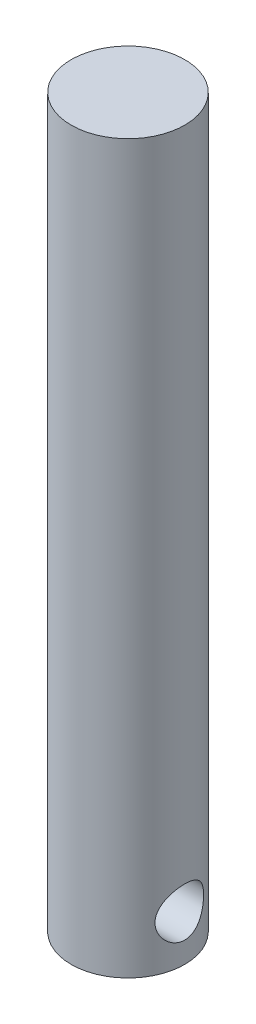
ISO-10303-21;
HEADER;
FILE_DESCRIPTION(('STEP AP214'),'2;1');
FILE_NAME('part.step','',(''),(''),'','','');
FILE_SCHEMA(('AUTOMOTIVE_DESIGN { 1 0 10303 214 1 1 1 1 }'));
ENDSEC;
DATA;
#1=APPLICATION_CONTEXT('core data for automotive mechanical design processes');
#2=APPLICATION_PROTOCOL_DEFINITION('international standard','automotive_design',2000,#1);
#3=PRODUCT_CONTEXT('',#1,'mechanical');
#4=PRODUCT('Part','Part','',(#3));
#5=PRODUCT_RELATED_PRODUCT_CATEGORY('part','',(#4));
#6=PRODUCT_DEFINITION_FORMATION('','',#4);
#7=PRODUCT_DEFINITION_CONTEXT('part definition',#1,'design');
#8=PRODUCT_DEFINITION('design','',#6,#7);
#9=PRODUCT_DEFINITION_SHAPE('','',#8);
#10=(LENGTH_UNIT() NAMED_UNIT(*) SI_UNIT(.MILLI.,.METRE.));
#11=(NAMED_UNIT(*) PLANE_ANGLE_UNIT() SI_UNIT($,.RADIAN.));
#12=(NAMED_UNIT(*) SI_UNIT($,.STERADIAN.) SOLID_ANGLE_UNIT());
#13=UNCERTAINTY_MEASURE_WITH_UNIT(LENGTH_MEASURE(1.E-05),#10,'distance_accuracy_value','');
#14=(GEOMETRIC_REPRESENTATION_CONTEXT(3) GLOBAL_UNCERTAINTY_ASSIGNED_CONTEXT((#13)) GLOBAL_UNIT_ASSIGNED_CONTEXT((#10,
#11,#12)) REPRESENTATION_CONTEXT('',''));
#15=CARTESIAN_POINT('',(0.,0.,0.));
#16=DIRECTION('',(0.,0.,1.));
#17=DIRECTION('',(1.,0.,0.));
#18=AXIS2_PLACEMENT_3D('',#15,#16,#17);
#19=CARTESIAN_POINT('',(0.,50.8,0.));
#20=DIRECTION('',(0.,-1.,0.));
#21=DIRECTION('',(0.,0.,-1.));
#22=AXIS2_PLACEMENT_3D('',#19,#20,#21);
#23=CYLINDRICAL_SURFACE('',#22,3.96875);
#24=CARTESIAN_POINT('',(-3.58622037282987,3.175,-1.7));
#25=CARTESIAN_POINT('',(-3.58623113706892,3.08459005344208,-1.69998911546172));
#26=CARTESIAN_POINT('',(-3.58968938900767,2.99404356277239,-1.69274199167995));
#27=CARTESIAN_POINT('',(-3.60307871804978,2.81557963908529,-1.6640411575309));
#28=CARTESIAN_POINT('',(-3.61302690266575,2.72766979872845,-1.64254989711271));
#29=CARTESIAN_POINT('',(-3.63804219046086,2.55739037711525,-1.58636684632454));
#30=CARTESIAN_POINT('',(-3.65308759133628,2.47499905225026,-1.55173094765683));
#31=CARTESIAN_POINT('',(-3.68657122753554,2.3172187711832,-1.4704064892417));
#32=CARTESIAN_POINT('',(-3.70500879408357,2.24182843911496,-1.42372030451515));
#33=CARTESIAN_POINT('',(-3.74455582562221,2.09518271102688,-1.31633507475202));
#34=CARTESIAN_POINT('',(-3.76575910737061,2.02444335997849,-1.25496554021632));
#35=CARTESIAN_POINT('',(-3.8076796275402,1.8938765569399,-1.12136187333479));
#36=CARTESIAN_POINT('',(-3.8283966693971,1.83405345386459,-1.04912343175391));
#37=CARTESIAN_POINT('',(-3.86816191973165,1.72433167004081,-0.891728093718384));
#38=CARTESIAN_POINT('',(-3.88708845202858,1.67502072481835,-0.80612793261505));
#39=CARTESIAN_POINT('',(-3.91998324015899,1.5917241528577,-0.626889116143654));
#40=CARTESIAN_POINT('',(-3.93395381514694,1.55773135592966,-0.53325424618402));
#41=CARTESIAN_POINT('',(-3.95469596900494,1.5079284067925,-0.346028881740543));
#42=CARTESIAN_POINT('',(-3.96181911296762,1.49122644157612,-0.252715371302695));
#43=CARTESIAN_POINT('',(-3.96934545838333,1.47359037231403,-0.064356867094234));
#44=CARTESIAN_POINT('',(-3.96975155028843,1.47264948602845,0.0306873642928482));
#45=CARTESIAN_POINT('',(-3.96399993382167,1.48611070884914,0.213297108302966));
#46=CARTESIAN_POINT('',(-3.95826228294521,1.49953089186249,0.300950773026008));
#47=CARTESIAN_POINT('',(-3.94145238730588,1.53964056824275,0.472621705663843));
#48=CARTESIAN_POINT('',(-3.93037974833308,1.56633104217516,0.556638704360109));
#49=CARTESIAN_POINT('',(-3.90374947102569,1.63253035483458,0.720204048389507));
#50=CARTESIAN_POINT('',(-3.88812579368853,1.67222909698207,0.799664337948033));
#51=CARTESIAN_POINT('',(-3.85390657578562,1.76312530568893,0.951004404799201));
#52=CARTESIAN_POINT('',(-3.83530996854243,1.8143269021171,1.02288144582381));
#53=CARTESIAN_POINT('',(-3.79537378132377,1.93116868168375,1.16266167991575));
#54=CARTESIAN_POINT('',(-3.77393305560751,1.99759621203648,1.22987875853107));
#55=CARTESIAN_POINT('',(-3.73173757559351,2.14080134495101,1.35252605827245));
#56=CARTESIAN_POINT('',(-3.71098312002685,2.21758338282395,1.40795120200164));
#57=CARTESIAN_POINT('',(-3.67176355740824,2.38283109399904,1.50734671475435));
#58=CARTESIAN_POINT('',(-3.65340926120111,2.47162028600367,1.55082677647832));
#59=CARTESIAN_POINT('',(-3.62240664524944,2.65625415543747,1.62193371634608));
#60=CARTESIAN_POINT('',(-3.60975397811487,2.75209339224905,1.64957267743231));
#61=CARTESIAN_POINT('',(-3.59268323727969,2.94121847824614,1.68641381079726));
#62=CARTESIAN_POINT('',(-3.58776749724183,3.03424084026704,1.69673336462996));
#63=CARTESIAN_POINT('',(-3.58530184937887,3.2207980552888,1.70194025822124));
#64=CARTESIAN_POINT('',(-3.5877491419163,3.31433270000521,1.69683346351972));
#65=CARTESIAN_POINT('',(-3.59921731420729,3.49241412668582,1.67235374478536));
#66=CARTESIAN_POINT('',(-3.60777054658429,3.57713436986088,1.653994735474));
#67=CARTESIAN_POINT('',(-3.62987674405693,3.74221182744115,1.60489586590083));
#68=CARTESIAN_POINT('',(-3.64343092274405,3.82256797736696,1.57415300025295));
#69=CARTESIAN_POINT('',(-3.6747268969317,3.98054569750963,1.49968412721792));
#70=CARTESIAN_POINT('',(-3.69262508180863,4.05789666043565,1.45545195142779));
#71=CARTESIAN_POINT('',(-3.73038151502514,4.20446332016495,1.35575407279594));
#72=CARTESIAN_POINT('',(-3.7502406424614,4.27367533751209,1.30028331983657));
#73=CARTESIAN_POINT('',(-3.79176455129882,4.40826919257133,1.17400308940507));
#74=CARTESIAN_POINT('',(-3.81343616572478,4.47279446689132,1.1022791902822));
#75=CARTESIAN_POINT('',(-3.85455404679553,4.58906239695361,0.948533416909004));
#76=CARTESIAN_POINT('',(-3.87400009165408,4.64080377932815,0.866510518030355));
#77=CARTESIAN_POINT('',(-3.90865457956745,4.73009137953567,0.693679406401621));
#78=CARTESIAN_POINT('',(-3.92384194401562,4.7675673052295,0.60283039006871));
#79=CARTESIAN_POINT('',(-3.94809086795851,4.82641480522334,0.415295380859746));
#80=CARTESIAN_POINT('',(-3.95715630336448,4.84779657003157,0.318613123443799));
#81=CARTESIAN_POINT('',(-3.96767127075444,4.8725130831658,0.129788880179495));
#82=CARTESIAN_POINT('',(-3.96962935609121,4.87705346004854,0.0378320493048763));
#83=CARTESIAN_POINT('',(-3.96714023501053,4.87124100800158,-0.145510784931608));
#84=CARTESIAN_POINT('',(-3.96269426781214,4.86089106043125,-0.236896895294529));
#85=CARTESIAN_POINT('',(-3.94817145617615,4.82645685339129,-0.412811561785949));
#86=CARTESIAN_POINT('',(-3.93832136204818,4.80292490796238,-0.497468546509107));
#87=CARTESIAN_POINT('',(-3.9140982764196,4.74341486237072,-0.661587998364473));
#88=CARTESIAN_POINT('',(-3.8997244519767,4.70743446998762,-0.741049505610523));
#89=CARTESIAN_POINT('',(-3.8670169985917,4.62222481149873,-0.89652381189233));
#90=CARTESIAN_POINT('',(-3.84853264024002,4.57246602223183,-0.97221391607124));
#91=CARTESIAN_POINT('',(-3.80976603642735,4.46186487546169,-1.11449824350403));
#92=CARTESIAN_POINT('',(-3.78948308203129,4.4010181374709,-1.18108885358492));
#93=CARTESIAN_POINT('',(-3.74754436850339,4.26477474597478,-1.30831783828415));
#94=CARTESIAN_POINT('',(-3.72589576200376,4.18864279864083,-1.368173975489));
#95=CARTESIAN_POINT('',(-3.68515605259579,4.02677477679791,-1.47439832182803));
#96=CARTESIAN_POINT('',(-3.66606644026516,3.94103315771583,-1.52075868812735));
#97=CARTESIAN_POINT('',(-3.63291840219493,3.76221239686101,-1.59833196339931));
#98=CARTESIAN_POINT('',(-3.61885058446783,3.66914735395346,-1.62957318823252));
#99=CARTESIAN_POINT('',(-3.59780126037644,3.47844788022475,-1.67555044144813));
#100=CARTESIAN_POINT('',(-3.59079599179021,3.38082993573814,-1.69034183337361));
#101=CARTESIAN_POINT('',(-3.58675667806582,3.24686351662433,-1.69886499090494));
#102=CARTESIAN_POINT('',(-3.58621609349779,3.21094254848225,-1.70000432715713));
#103=CARTESIAN_POINT('',(-3.58622037282987,3.175,-1.7));
#104=B_SPLINE_CURVE_WITH_KNOTS('',3,(#24,#25,#26,#27,#28,#29,#30,#31,#32,#33,#34,#35,#36,#37,
#38,#39,#40,#41,#42,#43,#44,#45,#46,#47,#48,#49,#50,#51,#52,#53,#54,#55,#56,#57,#58,#59,#60,#61,
#62,#63,#64,#65,#66,#67,#68,#69,#70,#71,#72,#73,#74,#75,#76,#77,#78,#79,#80,#81,#82,#83,#84,#85,
#86,#87,#88,#89,#90,#91,#92,#93,#94,#95,#96,#97,#98,#99,#100,#101,#102,#103),.UNSPECIFIED.,.T.,
.F.,(4,2,2,2,2,2,2,2,2,2,2,2,2,2,2,2,2,2,2,2,2,2,2,2,2,2,2,2,2,2,2,2,2,2,2,2,2,2,2,4),(0.,
0.271122267186831,0.542962118356002,0.813658812563502,1.08430219517141,1.37111310872573,
1.65803803635866,1.95824745055016,2.25831619498843,2.5419933352771,2.82554840169842,
3.09088463268955,3.35624047276307,3.62565692960539,3.89517027003921,4.18459901178047,
4.474152125282,4.77424342805826,5.07410552781407,5.35375082399783,5.63328980440983,
5.89344279537735,6.15365895985511,6.42518379870137,6.69683092044961,6.99210230451842,
7.2874030878983,7.58414067105511,7.88069020735217,8.15554910363005,8.43035482035872,
8.69442547174946,8.95854477423391,9.23471297067145,9.51099050964756,9.80731026576914,
10.103801880814,10.3997360421804,10.6946711649093,10.8024560448255),.UNSPECIFIED.);
#105=CARTESIAN_POINT('',(-3.58622037282987,3.175,-1.7));
#106=VERTEX_POINT('',#105);
#107=EDGE_CURVE('E45',#106,#106,#104,.T.);
#108=ORIENTED_EDGE('',*,*,#107,.F.);
#109=EDGE_LOOP('',(#108));
#110=FACE_BOUND('',#109,.T.);
#111=CARTESIAN_POINT('',(3.58622037282987,3.175,-1.7));
#112=CARTESIAN_POINT('',(3.58623113706892,3.26540994655792,-1.69998911546172));
#113=CARTESIAN_POINT('',(3.58968938900767,3.35595643722761,-1.69274199167995));
#114=CARTESIAN_POINT('',(3.60307871804978,3.53442036091471,-1.6640411575309));
#115=CARTESIAN_POINT('',(3.61302690266575,3.62233020127155,-1.64254989711271));
#116=CARTESIAN_POINT('',(3.63804219046086,3.79260962288475,-1.58636684632454));
#117=CARTESIAN_POINT('',(3.65308759133628,3.87500094774974,-1.55173094765683));
#118=CARTESIAN_POINT('',(3.68657122753554,4.0327812288168,-1.4704064892417));
#119=CARTESIAN_POINT('',(3.70500879408357,4.10817156088504,-1.42372030451515));
#120=CARTESIAN_POINT('',(3.74455582562221,4.25481728897312,-1.31633507475202));
#121=CARTESIAN_POINT('',(3.76575910737061,4.32555664002151,-1.25496554021632));
#122=CARTESIAN_POINT('',(3.8076796275402,4.4561234430601,-1.12136187333479));
#123=CARTESIAN_POINT('',(3.8283966693971,4.51594654613541,-1.04912343175391));
#124=CARTESIAN_POINT('',(3.86816191973165,4.62566832995919,-0.891728093718384));
#125=CARTESIAN_POINT('',(3.88708845202858,4.67497927518165,-0.80612793261505));
#126=CARTESIAN_POINT('',(3.91998324015899,4.7582758471423,-0.626889116143653));
#127=CARTESIAN_POINT('',(3.93395381514694,4.79226864407034,-0.533254246184019));
#128=CARTESIAN_POINT('',(3.95469596900494,4.8420715932075,-0.346028881740543));
#129=CARTESIAN_POINT('',(3.96181911296762,4.85877355842388,-0.252715371302695));
#130=CARTESIAN_POINT('',(3.96934545838333,4.87640962768597,-0.0643568670942337));
#131=CARTESIAN_POINT('',(3.96975155028843,4.87735051397155,0.0306873642928486));
#132=CARTESIAN_POINT('',(3.96399993382167,4.86388929115086,0.213297108302967));
#133=CARTESIAN_POINT('',(3.95826228294521,4.85046910813751,0.300950773026008));
#134=CARTESIAN_POINT('',(3.94145238730588,4.81035943175725,0.472621705663843));
#135=CARTESIAN_POINT('',(3.93037974833308,4.78366895782484,0.556638704360109));
#136=CARTESIAN_POINT('',(3.90374947102569,4.71746964516542,0.720204048389507));
#137=CARTESIAN_POINT('',(3.88812579368853,4.67777090301793,0.799664337948034));
#138=CARTESIAN_POINT('',(3.85390657578562,4.58687469431107,0.951004404799202));
#139=CARTESIAN_POINT('',(3.83530996854243,4.5356730978829,1.02288144582381));
#140=CARTESIAN_POINT('',(3.79537378132377,4.41883131831625,1.16266167991575));
#141=CARTESIAN_POINT('',(3.77393305560751,4.35240378796352,1.22987875853107));
#142=CARTESIAN_POINT('',(3.73173757559351,4.20919865504899,1.35252605827245));
#143=CARTESIAN_POINT('',(3.71098312002685,4.13241661717605,1.40795120200164));
#144=CARTESIAN_POINT('',(3.67176355740824,3.96716890600096,1.50734671475435));
#145=CARTESIAN_POINT('',(3.65340926120111,3.87837971399633,1.55082677647832));
#146=CARTESIAN_POINT('',(3.62240664524944,3.69374584456253,1.62193371634609));
#147=CARTESIAN_POINT('',(3.60975397811487,3.59790660775095,1.64957267743231));
#148=CARTESIAN_POINT('',(3.59268323727969,3.40878152175386,1.68641381079726));
#149=CARTESIAN_POINT('',(3.58776749724183,3.31575915973296,1.69673336462996));
#150=CARTESIAN_POINT('',(3.58530184937887,3.1292019447112,1.70194025822124));
#151=CARTESIAN_POINT('',(3.5877491419163,3.03566729999478,1.69683346351972));
#152=CARTESIAN_POINT('',(3.59921731420729,2.85758587331418,1.67235374478536));
#153=CARTESIAN_POINT('',(3.60777054658429,2.77286563013912,1.653994735474));
#154=CARTESIAN_POINT('',(3.62987674405693,2.60778817255885,1.60489586590083));
#155=CARTESIAN_POINT('',(3.64343092274405,2.52743202263304,1.57415300025295));
#156=CARTESIAN_POINT('',(3.6747268969317,2.36945430249037,1.49968412721792));
#157=CARTESIAN_POINT('',(3.69262508180863,2.29210333956435,1.45545195142779));
#158=CARTESIAN_POINT('',(3.73038151502514,2.14553667983505,1.35575407279594));
#159=CARTESIAN_POINT('',(3.7502406424614,2.07632466248791,1.30028331983657));
#160=CARTESIAN_POINT('',(3.79176455129882,1.94173080742867,1.17400308940507));
#161=CARTESIAN_POINT('',(3.81343616572478,1.87720553310868,1.1022791902822));
#162=CARTESIAN_POINT('',(3.85455404679553,1.76093760304639,0.948533416909004));
#163=CARTESIAN_POINT('',(3.87400009165408,1.70919622067185,0.866510518030355));
#164=CARTESIAN_POINT('',(3.90865457956745,1.61990862046433,0.693679406401621));
#165=CARTESIAN_POINT('',(3.92384194401562,1.5824326947705,0.60283039006871));
#166=CARTESIAN_POINT('',(3.94809086795851,1.52358519477665,0.415295380859746));
#167=CARTESIAN_POINT('',(3.95715630336448,1.50220342996843,0.318613123443799));
#168=CARTESIAN_POINT('',(3.96767127075444,1.4774869168342,0.129788880179494));
#169=CARTESIAN_POINT('',(3.96962935609121,1.47294653995146,0.0378320493048759));
#170=CARTESIAN_POINT('',(3.96714023501053,1.47875899199842,-0.145510784931608));
#171=CARTESIAN_POINT('',(3.96269426781214,1.48910893956875,-0.23689689529453));
#172=CARTESIAN_POINT('',(3.94817145617615,1.52354314660871,-0.412811561785949));
#173=CARTESIAN_POINT('',(3.93832136204818,1.54707509203762,-0.497468546509107));
#174=CARTESIAN_POINT('',(3.9140982764196,1.60658513762928,-0.661587998364473));
#175=CARTESIAN_POINT('',(3.8997244519767,1.64256553001238,-0.741049505610523));
#176=CARTESIAN_POINT('',(3.8670169985917,1.72777518850127,-0.89652381189233));
#177=CARTESIAN_POINT('',(3.84853264024002,1.77753397776817,-0.972213916071241));
#178=CARTESIAN_POINT('',(3.80976603642735,1.88813512453831,-1.11449824350403));
#179=CARTESIAN_POINT('',(3.78948308203129,1.9489818625291,-1.18108885358492));
#180=CARTESIAN_POINT('',(3.74754436850339,2.08522525402522,-1.30831783828415));
#181=CARTESIAN_POINT('',(3.72589576200376,2.16135720135917,-1.368173975489));
#182=CARTESIAN_POINT('',(3.68515605259579,2.32322522320209,-1.47439832182803));
#183=CARTESIAN_POINT('',(3.66606644026516,2.40896684228417,-1.52075868812735));
#184=CARTESIAN_POINT('',(3.63291840219493,2.58778760313899,-1.59833196339931));
#185=CARTESIAN_POINT('',(3.61885058446783,2.68085264604654,-1.62957318823252));
#186=CARTESIAN_POINT('',(3.59780126037644,2.87155211977525,-1.67555044144813));
#187=CARTESIAN_POINT('',(3.59079599179021,2.96917006426187,-1.69034183337361));
#188=CARTESIAN_POINT('',(3.58675667806582,3.10313648337567,-1.69886499090494));
#189=CARTESIAN_POINT('',(3.58621609349779,3.13905745151775,-1.70000432715713));
#190=CARTESIAN_POINT('',(3.58622037282987,3.175,-1.7));
#191=B_SPLINE_CURVE_WITH_KNOTS('',3,(#111,#112,#113,#114,#115,#116,#117,#118,#119,#120,#121,
#122,#123,#124,#125,#126,#127,#128,#129,#130,#131,#132,#133,#134,#135,#136,#137,#138,#139,#140,
#141,#142,#143,#144,#145,#146,#147,#148,#149,#150,#151,#152,#153,#154,#155,#156,#157,#158,#159,
#160,#161,#162,#163,#164,#165,#166,#167,#168,#169,#170,#171,#172,#173,#174,#175,#176,#177,#178,
#179,#180,#181,#182,#183,#184,#185,#186,#187,#188,#189,#190),.UNSPECIFIED.,.T.,.F.,(4,2,2,2,2,2,
2,2,2,2,2,2,2,2,2,2,2,2,2,2,2,2,2,2,2,2,2,2,2,2,2,2,2,2,2,2,2,2,2,4),(0.,0.271122267186831,
0.542962118356002,0.813658812563503,1.08430219517141,1.37111310872573,1.65803803635866,
1.95824745055017,2.25831619498843,2.5419933352771,2.82554840169842,3.09088463268955,
3.35624047276307,3.62565692960539,3.89517027003921,4.18459901178047,4.474152125282,
4.77424342805826,5.07410552781407,5.35375082399783,5.63328980440982,5.89344279537735,
6.15365895985511,6.42518379870137,6.69683092044961,6.99210230451842,7.2874030878983,
7.58414067105511,7.88069020735217,8.15554910363005,8.43035482035872,8.69442547174946,
8.95854477423391,9.23471297067144,9.51099050964756,9.80731026576914,10.1038018808139,
10.3997360421804,10.6946711649093,10.8024560448255),.UNSPECIFIED.);
#192=CARTESIAN_POINT('',(3.58622037282987,3.175,-1.7));
#193=VERTEX_POINT('',#192);
#194=EDGE_CURVE('E54',#193,#193,#191,.T.);
#195=ORIENTED_EDGE('',*,*,#194,.F.);
#196=EDGE_LOOP('',(#195));
#197=FACE_BOUND('',#196,.T.);
#198=CARTESIAN_POINT('',(0.,50.8,0.));
#199=DIRECTION('',(0.,1.,0.));
#200=DIRECTION('',(0.,0.,1.));
#201=AXIS2_PLACEMENT_3D('',#198,#199,#200);
#202=CIRCLE('',#201,3.96875);
#203=CARTESIAN_POINT('',(0.,50.8,3.96875));
#204=VERTEX_POINT('',#203);
#205=EDGE_CURVE('E10',#204,#204,#202,.T.);
#206=ORIENTED_EDGE('',*,*,#205,.F.);
#207=EDGE_LOOP('',(#206));
#208=FACE_BOUND('',#207,.T.);
#209=CARTESIAN_POINT('',(0.,0.,0.));
#210=DIRECTION('',(0.,1.,0.));
#211=DIRECTION('',(0.,0.,1.));
#212=AXIS2_PLACEMENT_3D('',#209,#210,#211);
#213=CIRCLE('',#212,3.96875);
#214=CARTESIAN_POINT('',(0.,0.,3.96875));
#215=VERTEX_POINT('',#214);
#216=EDGE_CURVE('E38',#215,#215,#213,.T.);
#217=ORIENTED_EDGE('',*,*,#216,.T.);
#218=EDGE_LOOP('',(#217));
#219=FACE_BOUND('',#218,.T.);
#220=ADVANCED_FACE('F35',(#110,#197,#208,#219),#23,.T.);
#221=CARTESIAN_POINT('',(0.,50.8,0.));
#222=DIRECTION('',(0.,1.,0.));
#223=DIRECTION('',(0.,0.,1.));
#224=AXIS2_PLACEMENT_3D('',#221,#222,#223);
#225=PLANE('',#224);
#226=ORIENTED_EDGE('',*,*,#205,.T.);
#227=EDGE_LOOP('',(#226));
#228=FACE_BOUND('',#227,.T.);
#229=ADVANCED_FACE('F66',(#228),#225,.T.);
#230=CARTESIAN_POINT('',(0.,0.,0.));
#231=DIRECTION('',(0.,1.,0.));
#232=DIRECTION('',(0.,0.,1.));
#233=AXIS2_PLACEMENT_3D('',#230,#231,#232);
#234=PLANE('',#233);
#235=ORIENTED_EDGE('',*,*,#216,.F.);
#236=EDGE_LOOP('',(#235));
#237=FACE_BOUND('',#236,.T.);
#238=ADVANCED_FACE('F64',(#237),#234,.F.);
#239=CARTESIAN_POINT('',(-3.96975,3.175,0.));
#240=DIRECTION('',(1.,0.,0.));
#241=DIRECTION('',(0.,0.,-1.));
#242=AXIS2_PLACEMENT_3D('',#239,#240,#241);
#243=CYLINDRICAL_SURFACE('',#242,1.7);
#244=ORIENTED_EDGE('',*,*,#194,.T.);
#245=EDGE_LOOP('',(#244));
#246=FACE_BOUND('',#245,.T.);
#247=ORIENTED_EDGE('',*,*,#107,.T.);
#248=EDGE_LOOP('',(#247));
#249=FACE_BOUND('',#248,.T.);
#250=ADVANCED_FACE('F58',(#246,#249),#243,.F.);
#251=CLOSED_SHELL('',(#220,#229,#238,#250));
#252=MANIFOLD_SOLID_BREP('B2',#251);
#253=ADVANCED_BREP_SHAPE_REPRESENTATION('',(#18,#252),#14);
#254=SHAPE_DEFINITION_REPRESENTATION(#9,#253);
ENDSEC;
END-ISO-10303-21;
